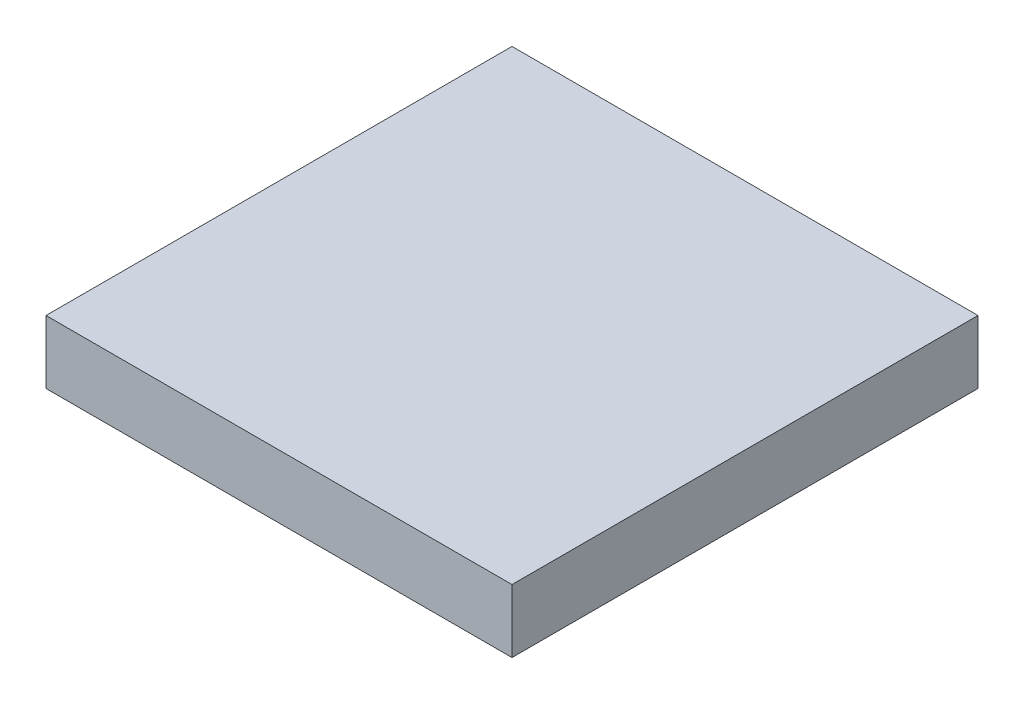
ISO-10303-21;
HEADER;
FILE_DESCRIPTION(('STEP AP214'),'2;1');
FILE_NAME('part.step','',(''),(''),'','','');
FILE_SCHEMA(('AUTOMOTIVE_DESIGN { 1 0 10303 214 1 1 1 1 }'));
ENDSEC;
DATA;
#1=APPLICATION_CONTEXT('core data for automotive mechanical design processes');
#2=APPLICATION_PROTOCOL_DEFINITION('international standard','automotive_design',2000,#1);
#3=PRODUCT_CONTEXT('',#1,'mechanical');
#4=PRODUCT('Part','Part','',(#3));
#5=PRODUCT_RELATED_PRODUCT_CATEGORY('part','',(#4));
#6=PRODUCT_DEFINITION_FORMATION('','',#4);
#7=PRODUCT_DEFINITION_CONTEXT('part definition',#1,'design');
#8=PRODUCT_DEFINITION('design','',#6,#7);
#9=PRODUCT_DEFINITION_SHAPE('','',#8);
#10=(LENGTH_UNIT() NAMED_UNIT(*) SI_UNIT(.MILLI.,.METRE.));
#11=(NAMED_UNIT(*) PLANE_ANGLE_UNIT() SI_UNIT($,.RADIAN.));
#12=(NAMED_UNIT(*) SI_UNIT($,.STERADIAN.) SOLID_ANGLE_UNIT());
#13=UNCERTAINTY_MEASURE_WITH_UNIT(LENGTH_MEASURE(1.E-05),#10,'distance_accuracy_value','');
#14=(GEOMETRIC_REPRESENTATION_CONTEXT(3) GLOBAL_UNCERTAINTY_ASSIGNED_CONTEXT((#13)) GLOBAL_UNIT_ASSIGNED_CONTEXT((#10,
#11,#12)) REPRESENTATION_CONTEXT('',''));
#15=CARTESIAN_POINT('',(0.,0.,0.));
#16=DIRECTION('',(0.,0.,1.));
#17=DIRECTION('',(1.,0.,0.));
#18=AXIS2_PLACEMENT_3D('',#15,#16,#17);
#19=CARTESIAN_POINT('',(7.,1.9,-7.));
#20=DIRECTION('',(-1.,0.,0.));
#21=DIRECTION('',(0.,0.,1.));
#22=AXIS2_PLACEMENT_3D('',#19,#20,#21);
#23=PLANE('',#22);
#24=DIRECTION('',(0.,0.,-1.));
#25=VECTOR('',#24,1.);
#26=CARTESIAN_POINT('',(7.,0.,-7.));
#27=LINE('',#26,#25);
#28=CARTESIAN_POINT('',(7.,0.,7.));
#29=VERTEX_POINT('',#28);
#30=CARTESIAN_POINT('',(7.,0.,-7.));
#31=VERTEX_POINT('',#30);
#32=EDGE_CURVE('E98',#29,#31,#27,.T.);
#33=ORIENTED_EDGE('',*,*,#32,.T.);
#34=DIRECTION('',(0.,-1.,0.));
#35=VECTOR('',#34,1.);
#36=CARTESIAN_POINT('',(7.,1.9,-7.));
#37=LINE('',#36,#35);
#38=CARTESIAN_POINT('',(7.,1.9,-7.));
#39=VERTEX_POINT('',#38);
#40=EDGE_CURVE('E11',#39,#31,#37,.T.);
#41=ORIENTED_EDGE('',*,*,#40,.F.);
#42=DIRECTION('',(0.,0.,-1.));
#43=VECTOR('',#42,1.);
#44=CARTESIAN_POINT('',(7.,1.9,-7.));
#45=LINE('',#44,#43);
#46=CARTESIAN_POINT('',(7.,1.9,7.));
#47=VERTEX_POINT('',#46);
#48=EDGE_CURVE('E86',#47,#39,#45,.T.);
#49=ORIENTED_EDGE('',*,*,#48,.F.);
#50=DIRECTION('',(0.,-1.,0.));
#51=VECTOR('',#50,1.);
#52=CARTESIAN_POINT('',(7.,1.9,7.));
#53=LINE('',#52,#51);
#54=EDGE_CURVE('E94',#47,#29,#53,.T.);
#55=ORIENTED_EDGE('',*,*,#54,.T.);
#56=EDGE_LOOP('',(#33,#41,#49,#55));
#57=FACE_BOUND('',#56,.T.);
#58=ADVANCED_FACE('F35',(#57),#23,.F.);
#59=CARTESIAN_POINT('',(-7.,1.9,-7.));
#60=DIRECTION('',(0.,0.,1.));
#61=DIRECTION('',(1.,0.,0.));
#62=AXIS2_PLACEMENT_3D('',#59,#60,#61);
#63=PLANE('',#62);
#64=DIRECTION('',(-1.,0.,0.));
#65=VECTOR('',#64,1.);
#66=CARTESIAN_POINT('',(-7.,0.,-7.));
#67=LINE('',#66,#65);
#68=CARTESIAN_POINT('',(-7.,0.,-7.));
#69=VERTEX_POINT('',#68);
#70=EDGE_CURVE('E90',#31,#69,#67,.T.);
#71=ORIENTED_EDGE('',*,*,#70,.T.);
#72=DIRECTION('',(0.,-1.,0.));
#73=VECTOR('',#72,1.);
#74=CARTESIAN_POINT('',(-7.,1.9,-7.));
#75=LINE('',#74,#73);
#76=CARTESIAN_POINT('',(-7.,1.9,-7.));
#77=VERTEX_POINT('',#76);
#78=EDGE_CURVE('E43',#77,#69,#75,.T.);
#79=ORIENTED_EDGE('',*,*,#78,.F.);
#80=DIRECTION('',(-1.,0.,0.));
#81=VECTOR('',#80,1.);
#82=CARTESIAN_POINT('',(-7.,1.9,-7.));
#83=LINE('',#82,#81);
#84=EDGE_CURVE('E81',#39,#77,#83,.T.);
#85=ORIENTED_EDGE('',*,*,#84,.F.);
#86=ORIENTED_EDGE('',*,*,#40,.T.);
#87=EDGE_LOOP('',(#71,#79,#85,#86));
#88=FACE_BOUND('',#87,.T.);
#89=ADVANCED_FACE('F89',(#88),#63,.F.);
#90=CARTESIAN_POINT('',(-7.,1.9,-7.));
#91=DIRECTION('',(1.,0.,0.));
#92=DIRECTION('',(0.,0.,-1.));
#93=AXIS2_PLACEMENT_3D('',#90,#91,#92);
#94=PLANE('',#93);
#95=DIRECTION('',(0.,0.,1.));
#96=VECTOR('',#95,1.);
#97=CARTESIAN_POINT('',(-7.,0.,-7.));
#98=LINE('',#97,#96);
#99=CARTESIAN_POINT('',(-7.,0.,7.));
#100=VERTEX_POINT('',#99);
#101=EDGE_CURVE('E68',#69,#100,#98,.T.);
#102=ORIENTED_EDGE('',*,*,#101,.T.);
#103=DIRECTION('',(0.,-1.,0.));
#104=VECTOR('',#103,1.);
#105=CARTESIAN_POINT('',(-7.,1.9,7.));
#106=LINE('',#105,#104);
#107=CARTESIAN_POINT('',(-7.,1.9,7.));
#108=VERTEX_POINT('',#107);
#109=EDGE_CURVE('E91',#108,#100,#106,.T.);
#110=ORIENTED_EDGE('',*,*,#109,.F.);
#111=DIRECTION('',(0.,0.,1.));
#112=VECTOR('',#111,1.);
#113=CARTESIAN_POINT('',(-7.,1.9,-7.));
#114=LINE('',#113,#112);
#115=EDGE_CURVE('E84',#77,#108,#114,.T.);
#116=ORIENTED_EDGE('',*,*,#115,.F.);
#117=ORIENTED_EDGE('',*,*,#78,.T.);
#118=EDGE_LOOP('',(#102,#110,#116,#117));
#119=FACE_BOUND('',#118,.T.);
#120=ADVANCED_FACE('F92',(#119),#94,.F.);
#121=CARTESIAN_POINT('',(-7.,1.9,7.));
#122=DIRECTION('',(0.,0.,-1.));
#123=DIRECTION('',(-1.,0.,0.));
#124=AXIS2_PLACEMENT_3D('',#121,#122,#123);
#125=PLANE('',#124);
#126=DIRECTION('',(1.,0.,0.));
#127=VECTOR('',#126,1.);
#128=CARTESIAN_POINT('',(-7.,0.,7.));
#129=LINE('',#128,#127);
#130=EDGE_CURVE('E74',#100,#29,#129,.T.);
#131=ORIENTED_EDGE('',*,*,#130,.T.);
#132=ORIENTED_EDGE('',*,*,#54,.F.);
#133=DIRECTION('',(1.,0.,0.));
#134=VECTOR('',#133,1.);
#135=CARTESIAN_POINT('',(-7.,1.9,7.));
#136=LINE('',#135,#134);
#137=EDGE_CURVE('E51',#108,#47,#136,.T.);
#138=ORIENTED_EDGE('',*,*,#137,.F.);
#139=ORIENTED_EDGE('',*,*,#109,.T.);
#140=EDGE_LOOP('',(#131,#132,#138,#139));
#141=FACE_BOUND('',#140,.T.);
#142=ADVANCED_FACE('F105',(#141),#125,.F.);
#143=CARTESIAN_POINT('',(0.,1.9,0.));
#144=DIRECTION('',(0.,1.,0.));
#145=DIRECTION('',(0.,0.,1.));
#146=AXIS2_PLACEMENT_3D('',#143,#144,#145);
#147=PLANE('',#146);
#148=ORIENTED_EDGE('',*,*,#48,.T.);
#149=ORIENTED_EDGE('',*,*,#84,.T.);
#150=ORIENTED_EDGE('',*,*,#115,.T.);
#151=ORIENTED_EDGE('',*,*,#137,.T.);
#152=EDGE_LOOP('',(#148,#149,#150,#151));
#153=FACE_BOUND('',#152,.T.);
#154=ADVANCED_FACE('F82',(#153),#147,.T.);
#155=CARTESIAN_POINT('',(0.,0.,0.));
#156=DIRECTION('',(0.,1.,0.));
#157=DIRECTION('',(0.,0.,1.));
#158=AXIS2_PLACEMENT_3D('',#155,#156,#157);
#159=PLANE('',#158);
#160=ORIENTED_EDGE('',*,*,#32,.F.);
#161=ORIENTED_EDGE('',*,*,#130,.F.);
#162=ORIENTED_EDGE('',*,*,#101,.F.);
#163=ORIENTED_EDGE('',*,*,#70,.F.);
#164=EDGE_LOOP('',(#160,#161,#162,#163));
#165=FACE_BOUND('',#164,.T.);
#166=ADVANCED_FACE('F108',(#165),#159,.F.);
#167=CLOSED_SHELL('',(#58,#89,#120,#142,#154,#166));
#168=MANIFOLD_SOLID_BREP('B2',#167);
#169=ADVANCED_BREP_SHAPE_REPRESENTATION('',(#18,#168),#14);
#170=SHAPE_DEFINITION_REPRESENTATION(#9,#169);
ENDSEC;
END-ISO-10303-21;
